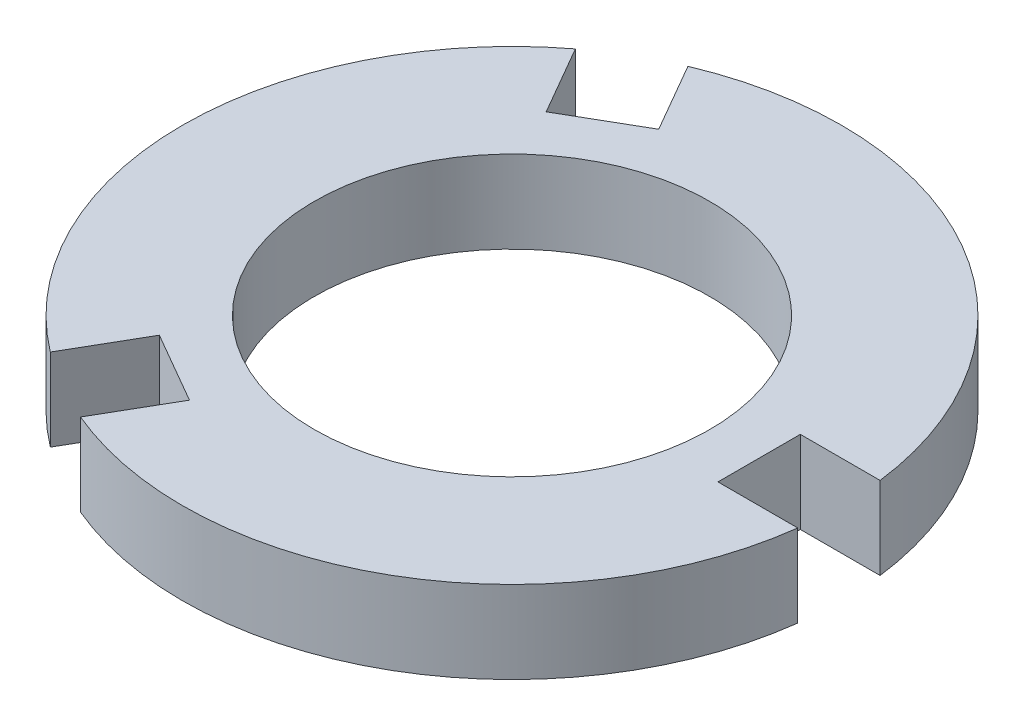
ISO-10303-21;
HEADER;
FILE_DESCRIPTION(('STEP AP214'),'2;1');
FILE_NAME('part.step','',(''),(''),'','','');
FILE_SCHEMA(('AUTOMOTIVE_DESIGN { 1 0 10303 214 1 1 1 1 }'));
ENDSEC;
DATA;
#1=APPLICATION_CONTEXT('core data for automotive mechanical design processes');
#2=APPLICATION_PROTOCOL_DEFINITION('international standard','automotive_design',2000,#1);
#3=PRODUCT_CONTEXT('',#1,'mechanical');
#4=PRODUCT('Part','Part','',(#3));
#5=PRODUCT_RELATED_PRODUCT_CATEGORY('part','',(#4));
#6=PRODUCT_DEFINITION_FORMATION('','',#4);
#7=PRODUCT_DEFINITION_CONTEXT('part definition',#1,'design');
#8=PRODUCT_DEFINITION('design','',#6,#7);
#9=PRODUCT_DEFINITION_SHAPE('','',#8);
#10=(LENGTH_UNIT() NAMED_UNIT(*) SI_UNIT(.MILLI.,.METRE.));
#11=(NAMED_UNIT(*) PLANE_ANGLE_UNIT() SI_UNIT($,.RADIAN.));
#12=(NAMED_UNIT(*) SI_UNIT($,.STERADIAN.) SOLID_ANGLE_UNIT());
#13=UNCERTAINTY_MEASURE_WITH_UNIT(LENGTH_MEASURE(1.E-05),#10,'distance_accuracy_value','');
#14=(GEOMETRIC_REPRESENTATION_CONTEXT(3) GLOBAL_UNCERTAINTY_ASSIGNED_CONTEXT((#13)) GLOBAL_UNIT_ASSIGNED_CONTEXT((#10,
#11,#12)) REPRESENTATION_CONTEXT('',''));
#15=CARTESIAN_POINT('',(0.,0.,0.));
#16=DIRECTION('',(0.,0.,1.));
#17=DIRECTION('',(1.,0.,0.));
#18=AXIS2_PLACEMENT_3D('',#15,#16,#17);
#19=CARTESIAN_POINT('',(0.,25.,0.));
#20=DIRECTION('',(0.,-1.,0.));
#21=DIRECTION('',(0.,0.,-1.));
#22=AXIS2_PLACEMENT_3D('',#19,#20,#21);
#23=CYLINDRICAL_SURFACE('',#22,100.);
#24=CARTESIAN_POINT('',(0.,25.,0.));
#25=DIRECTION('',(0.,1.,0.));
#26=DIRECTION('',(0.,0.,1.));
#27=AXIS2_PLACEMENT_3D('',#24,#25,#26);
#28=CIRCLE('',#27,100.);
#29=CARTESIAN_POINT('',(-60.4331546297669,25.,-79.6732942804217));
#30=VERTEX_POINT('',#29);
#31=CARTESIAN_POINT('',(-60.4331546297658,25.,79.6732942804226));
#32=VERTEX_POINT('',#31);
#33=EDGE_CURVE('E209',#30,#32,#28,.T.);
#34=ORIENTED_EDGE('',*,*,#33,.F.);
#35=DIRECTION('',(0.,-1.,0.));
#36=VECTOR('',#35,1.);
#37=CARTESIAN_POINT('',(-60.4331546297669,25.,-79.6732942804217));
#38=LINE('',#37,#36);
#39=CARTESIAN_POINT('',(-60.4331546297669,0.,-79.6732942804217));
#40=VERTEX_POINT('',#39);
#41=EDGE_CURVE('E11',#30,#40,#38,.T.);
#42=ORIENTED_EDGE('',*,*,#41,.T.);
#43=CARTESIAN_POINT('',(0.,0.,0.));
#44=DIRECTION('',(0.,1.,0.));
#45=DIRECTION('',(0.,0.,1.));
#46=AXIS2_PLACEMENT_3D('',#43,#44,#45);
#47=CIRCLE('',#46,100.);
#48=CARTESIAN_POINT('',(-60.4331546297658,0.,79.6732942804226));
#49=VERTEX_POINT('',#48);
#50=EDGE_CURVE('E213',#40,#49,#47,.T.);
#51=ORIENTED_EDGE('',*,*,#50,.T.);
#52=DIRECTION('',(0.,-1.,0.));
#53=VECTOR('',#52,1.);
#54=CARTESIAN_POINT('',(-60.4331546297658,25.,79.6732942804226));
#55=LINE('',#54,#53);
#56=EDGE_CURVE('E219',#49,#32,#55,.F.);
#57=ORIENTED_EDGE('',*,*,#56,.T.);
#58=EDGE_LOOP('',(#34,#42,#51,#57));
#59=FACE_BOUND('',#58,.T.);
#60=ADVANCED_FACE('F37',(#59),#23,.T.);
#61=CARTESIAN_POINT('',(-38.7825195351547,25.,92.1732942804224));
#62=VERTEX_POINT('',#61);
#63=CARTESIAN_POINT('',(99.2156741649221,25.,12.5));
#64=VERTEX_POINT('',#63);
#65=EDGE_CURVE('E210',#62,#64,#28,.T.);
#66=ORIENTED_EDGE('',*,*,#65,.F.);
#67=DIRECTION('',(0.,-1.,0.));
#68=VECTOR('',#67,1.);
#69=CARTESIAN_POINT('',(-38.7825195351547,25.,92.1732942804224));
#70=LINE('',#69,#68);
#71=CARTESIAN_POINT('',(-38.7825195351547,0.,92.1732942804224));
#72=VERTEX_POINT('',#71);
#73=EDGE_CURVE('E221',#62,#72,#70,.T.);
#74=ORIENTED_EDGE('',*,*,#73,.T.);
#75=CARTESIAN_POINT('',(99.2156741649221,0.,12.5));
#76=VERTEX_POINT('',#75);
#77=EDGE_CURVE('E202',#72,#76,#47,.T.);
#78=ORIENTED_EDGE('',*,*,#77,.T.);
#79=DIRECTION('',(0.,-1.,0.));
#80=VECTOR('',#79,1.);
#81=CARTESIAN_POINT('',(99.2156741649221,25.,12.5));
#82=LINE('',#81,#80);
#83=EDGE_CURVE('E208',#76,#64,#82,.F.);
#84=ORIENTED_EDGE('',*,*,#83,.T.);
#85=EDGE_LOOP('',(#66,#74,#78,#84));
#86=FACE_BOUND('',#85,.T.);
#87=ADVANCED_FACE('F244',(#86),#23,.T.);
#88=CARTESIAN_POINT('',(0.,25.,0.));
#89=DIRECTION('',(0.,1.,0.));
#90=DIRECTION('',(0.,0.,1.));
#91=AXIS2_PLACEMENT_3D('',#88,#89,#90);
#92=PLANE('',#91);
#93=DIRECTION('',(0.500000000000004,0.,0.866025403784436));
#94=VECTOR('',#93,1.);
#95=CARTESIAN_POINT('',(-48.3253175473058,25.,-58.7019052838327));
#96=LINE('',#95,#94);
#97=CARTESIAN_POINT('',(-48.3253175473058,25.,-58.7019052838327));
#98=VERTEX_POINT('',#97);
#99=EDGE_CURVE('E148',#30,#98,#96,.T.);
#100=ORIENTED_EDGE('',*,*,#99,.F.);
#101=ORIENTED_EDGE('',*,*,#33,.T.);
#102=DIRECTION('',(-0.499999999999992,0.,0.866025403784443));
#103=VECTOR('',#102,1.);
#104=CARTESIAN_POINT('',(-48.3253175473049,25.,58.7019052838334));
#105=LINE('',#104,#103);
#106=CARTESIAN_POINT('',(-48.3253175473049,25.,58.7019052838334));
#107=VERTEX_POINT('',#106);
#108=EDGE_CURVE('E52',#107,#32,#105,.T.);
#109=ORIENTED_EDGE('',*,*,#108,.F.);
#110=DIRECTION('',(-0.866025403784443,0.,-0.499999999999991));
#111=VECTOR('',#110,1.);
#112=CARTESIAN_POINT('',(-26.6746824526939,25.,71.2019052838331));
#113=LINE('',#112,#111);
#114=CARTESIAN_POINT('',(-26.6746824526939,25.,71.2019052838331));
#115=VERTEX_POINT('',#114);
#116=EDGE_CURVE('E169',#115,#107,#113,.T.);
#117=ORIENTED_EDGE('',*,*,#116,.F.);
#118=DIRECTION('',(0.499999999999992,0.,-0.866025403784443));
#119=VECTOR('',#118,1.);
#120=CARTESIAN_POINT('',(-26.6746824526939,25.,71.2019052838331));
#121=LINE('',#120,#119);
#122=EDGE_CURVE('E162',#62,#115,#121,.T.);
#123=ORIENTED_EDGE('',*,*,#122,.F.);
#124=ORIENTED_EDGE('',*,*,#65,.T.);
#125=DIRECTION('',(1.,0.,0.));
#126=VECTOR('',#125,1.);
#127=CARTESIAN_POINT('',(75.,25.,12.5));
#128=LINE('',#127,#126);
#129=CARTESIAN_POINT('',(75.,25.,12.5));
#130=VERTEX_POINT('',#129);
#131=EDGE_CURVE('E190',#130,#64,#128,.T.);
#132=ORIENTED_EDGE('',*,*,#131,.F.);
#133=DIRECTION('',(0.,0.,1.));
#134=VECTOR('',#133,1.);
#135=CARTESIAN_POINT('',(75.,25.,-12.5));
#136=LINE('',#135,#134);
#137=CARTESIAN_POINT('',(75.,25.,-12.5));
#138=VERTEX_POINT('',#137);
#139=EDGE_CURVE('E156',#138,#130,#136,.T.);
#140=ORIENTED_EDGE('',*,*,#139,.F.);
#141=DIRECTION('',(-1.,0.,0.));
#142=VECTOR('',#141,1.);
#143=CARTESIAN_POINT('',(75.,25.,-12.5));
#144=LINE('',#143,#142);
#145=CARTESIAN_POINT('',(99.2156741649222,25.,-12.5));
#146=VERTEX_POINT('',#145);
#147=EDGE_CURVE('E181',#146,#138,#144,.T.);
#148=ORIENTED_EDGE('',*,*,#147,.F.);
#149=CARTESIAN_POINT('',(-38.782519535156,25.,-92.1732942804218));
#150=VERTEX_POINT('',#149);
#151=EDGE_CURVE('E205',#146,#150,#28,.T.);
#152=ORIENTED_EDGE('',*,*,#151,.T.);
#153=DIRECTION('',(-0.500000000000004,0.,-0.866025403784436));
#154=VECTOR('',#153,1.);
#155=CARTESIAN_POINT('',(-26.6746824526949,25.,-71.2019052838328));
#156=LINE('',#155,#154);
#157=CARTESIAN_POINT('',(-26.6746824526949,25.,-71.2019052838328));
#158=VERTEX_POINT('',#157);
#159=EDGE_CURVE('E60',#158,#150,#156,.T.);
#160=ORIENTED_EDGE('',*,*,#159,.F.);
#161=DIRECTION('',(0.866025403784436,0.,-0.500000000000005));
#162=VECTOR('',#161,1.);
#163=CARTESIAN_POINT('',(-48.3253175473058,25.,-58.7019052838327));
#164=LINE('',#163,#162);
#165=EDGE_CURVE('E134',#98,#158,#164,.T.);
#166=ORIENTED_EDGE('',*,*,#165,.F.);
#167=EDGE_LOOP('',(#100,#101,#109,#117,#123,#124,#132,#140,#148,#152,#160,#166));
#168=FACE_BOUND('',#167,.T.);
#169=CARTESIAN_POINT('',(0.,25.,0.));
#170=DIRECTION('',(0.,1.,0.));
#171=DIRECTION('',(0.,0.,1.));
#172=AXIS2_PLACEMENT_3D('',#169,#170,#171);
#173=CIRCLE('',#172,60.);
#174=CARTESIAN_POINT('',(0.,25.,60.));
#175=VERTEX_POINT('',#174);
#176=EDGE_CURVE('E199',#175,#175,#173,.T.);
#177=ORIENTED_EDGE('',*,*,#176,.F.);
#178=EDGE_LOOP('',(#177));
#179=FACE_BOUND('',#178,.T.);
#180=ADVANCED_FACE('F228',(#168,#179),#92,.T.);
#181=CARTESIAN_POINT('',(0.,0.,0.));
#182=DIRECTION('',(0.,1.,0.));
#183=DIRECTION('',(0.,0.,1.));
#184=AXIS2_PLACEMENT_3D('',#181,#182,#183);
#185=PLANE('',#184);
#186=ORIENTED_EDGE('',*,*,#50,.F.);
#187=DIRECTION('',(0.500000000000004,0.,0.866025403784436));
#188=VECTOR('',#187,1.);
#189=CARTESIAN_POINT('',(-48.3253175473058,0.,-58.7019052838327));
#190=LINE('',#189,#188);
#191=CARTESIAN_POINT('',(-48.3253175473058,0.,-58.7019052838327));
#192=VERTEX_POINT('',#191);
#193=EDGE_CURVE('E136',#40,#192,#190,.T.);
#194=ORIENTED_EDGE('',*,*,#193,.T.);
#195=DIRECTION('',(0.866025403784436,0.,-0.500000000000005));
#196=VECTOR('',#195,1.);
#197=CARTESIAN_POINT('',(-48.3253175473058,0.,-58.7019052838327));
#198=LINE('',#197,#196);
#199=CARTESIAN_POINT('',(-26.6746824526949,0.,-71.2019052838328));
#200=VERTEX_POINT('',#199);
#201=EDGE_CURVE('E131',#192,#200,#198,.T.);
#202=ORIENTED_EDGE('',*,*,#201,.T.);
#203=DIRECTION('',(-0.500000000000004,0.,-0.866025403784436));
#204=VECTOR('',#203,1.);
#205=CARTESIAN_POINT('',(-26.6746824526949,0.,-71.2019052838328));
#206=LINE('',#205,#204);
#207=CARTESIAN_POINT('',(-38.782519535156,0.,-92.1732942804218));
#208=VERTEX_POINT('',#207);
#209=EDGE_CURVE('E139',#200,#208,#206,.T.);
#210=ORIENTED_EDGE('',*,*,#209,.T.);
#211=CARTESIAN_POINT('',(99.2156741649222,0.,-12.5));
#212=VERTEX_POINT('',#211);
#213=EDGE_CURVE('E211',#212,#208,#47,.T.);
#214=ORIENTED_EDGE('',*,*,#213,.F.);
#215=DIRECTION('',(-1.,0.,0.));
#216=VECTOR('',#215,1.);
#217=CARTESIAN_POINT('',(75.,0.,-12.5));
#218=LINE('',#217,#216);
#219=CARTESIAN_POINT('',(75.,0.,-12.5));
#220=VERTEX_POINT('',#219);
#221=EDGE_CURVE('E184',#212,#220,#218,.T.);
#222=ORIENTED_EDGE('',*,*,#221,.T.);
#223=DIRECTION('',(0.,0.,1.));
#224=VECTOR('',#223,1.);
#225=CARTESIAN_POINT('',(75.,0.,-12.5));
#226=LINE('',#225,#224);
#227=CARTESIAN_POINT('',(75.,0.,12.5));
#228=VERTEX_POINT('',#227);
#229=EDGE_CURVE('E177',#220,#228,#226,.T.);
#230=ORIENTED_EDGE('',*,*,#229,.T.);
#231=DIRECTION('',(1.,0.,0.));
#232=VECTOR('',#231,1.);
#233=CARTESIAN_POINT('',(75.,0.,12.5));
#234=LINE('',#233,#232);
#235=EDGE_CURVE('E180',#228,#76,#234,.T.);
#236=ORIENTED_EDGE('',*,*,#235,.T.);
#237=ORIENTED_EDGE('',*,*,#77,.F.);
#238=DIRECTION('',(0.499999999999992,0.,-0.866025403784443));
#239=VECTOR('',#238,1.);
#240=CARTESIAN_POINT('',(-26.6746824526939,0.,71.2019052838331));
#241=LINE('',#240,#239);
#242=CARTESIAN_POINT('',(-26.6746824526939,0.,71.2019052838331));
#243=VERTEX_POINT('',#242);
#244=EDGE_CURVE('E165',#72,#243,#241,.T.);
#245=ORIENTED_EDGE('',*,*,#244,.T.);
#246=DIRECTION('',(-0.866025403784443,0.,-0.499999999999991));
#247=VECTOR('',#246,1.);
#248=CARTESIAN_POINT('',(-26.6746824526939,0.,71.2019052838331));
#249=LINE('',#248,#247);
#250=CARTESIAN_POINT('',(-48.3253175473049,0.,58.7019052838334));
#251=VERTEX_POINT('',#250);
#252=EDGE_CURVE('E158',#243,#251,#249,.T.);
#253=ORIENTED_EDGE('',*,*,#252,.T.);
#254=DIRECTION('',(-0.499999999999992,0.,0.866025403784443));
#255=VECTOR('',#254,1.);
#256=CARTESIAN_POINT('',(-48.3253175473049,0.,58.7019052838334));
#257=LINE('',#256,#255);
#258=EDGE_CURVE('E161',#251,#49,#257,.T.);
#259=ORIENTED_EDGE('',*,*,#258,.T.);
#260=EDGE_LOOP('',(#186,#194,#202,#210,#214,#222,#230,#236,#237,#245,#253,#259));
#261=FACE_BOUND('',#260,.T.);
#262=CARTESIAN_POINT('',(0.,0.,0.));
#263=DIRECTION('',(0.,1.,0.));
#264=DIRECTION('',(0.,0.,1.));
#265=AXIS2_PLACEMENT_3D('',#262,#263,#264);
#266=CIRCLE('',#265,60.);
#267=CARTESIAN_POINT('',(0.,0.,60.));
#268=VERTEX_POINT('',#267);
#269=EDGE_CURVE('E197',#268,#268,#266,.T.);
#270=ORIENTED_EDGE('',*,*,#269,.T.);
#271=EDGE_LOOP('',(#270));
#272=FACE_BOUND('',#271,.T.);
#273=ADVANCED_FACE('F146',(#261,#272),#185,.F.);
#274=ORIENTED_EDGE('',*,*,#213,.T.);
#275=DIRECTION('',(0.,-1.,0.));
#276=VECTOR('',#275,1.);
#277=CARTESIAN_POINT('',(-38.782519535156,25.,-92.1732942804218));
#278=LINE('',#277,#276);
#279=EDGE_CURVE('E45',#208,#150,#278,.F.);
#280=ORIENTED_EDGE('',*,*,#279,.T.);
#281=ORIENTED_EDGE('',*,*,#151,.F.);
#282=DIRECTION('',(0.,-1.,0.));
#283=VECTOR('',#282,1.);
#284=CARTESIAN_POINT('',(99.2156741649222,25.,-12.5));
#285=LINE('',#284,#283);
#286=EDGE_CURVE('E216',#146,#212,#285,.T.);
#287=ORIENTED_EDGE('',*,*,#286,.T.);
#288=EDGE_LOOP('',(#274,#280,#281,#287));
#289=FACE_BOUND('',#288,.T.);
#290=ADVANCED_FACE('F39',(#289),#23,.T.);
#291=CARTESIAN_POINT('',(0.,25.,0.));
#292=DIRECTION('',(0.,-1.,0.));
#293=DIRECTION('',(0.,0.,-1.));
#294=AXIS2_PLACEMENT_3D('',#291,#292,#293);
#295=CYLINDRICAL_SURFACE('',#294,60.);
#296=ORIENTED_EDGE('',*,*,#176,.T.);
#297=EDGE_LOOP('',(#296));
#298=FACE_BOUND('',#297,.T.);
#299=ORIENTED_EDGE('',*,*,#269,.F.);
#300=EDGE_LOOP('',(#299));
#301=FACE_BOUND('',#300,.T.);
#302=ADVANCED_FACE('F272',(#298,#301),#295,.F.);
#303=CARTESIAN_POINT('',(75.,0.,-12.5));
#304=DIRECTION('',(0.,0.,-1.));
#305=DIRECTION('',(-1.,0.,0.));
#306=AXIS2_PLACEMENT_3D('',#303,#304,#305);
#307=PLANE('',#306);
#308=ORIENTED_EDGE('',*,*,#147,.T.);
#309=DIRECTION('',(0.,1.,0.));
#310=VECTOR('',#309,1.);
#311=CARTESIAN_POINT('',(75.,0.,-12.5));
#312=LINE('',#311,#310);
#313=EDGE_CURVE('E194',#220,#138,#312,.T.);
#314=ORIENTED_EDGE('',*,*,#313,.F.);
#315=ORIENTED_EDGE('',*,*,#221,.F.);
#316=ORIENTED_EDGE('',*,*,#286,.F.);
#317=EDGE_LOOP('',(#308,#314,#315,#316));
#318=FACE_BOUND('',#317,.T.);
#319=ADVANCED_FACE('F233',(#318),#307,.F.);
#320=CARTESIAN_POINT('',(75.,0.,12.5));
#321=DIRECTION('',(0.,0.,1.));
#322=DIRECTION('',(1.,0.,0.));
#323=AXIS2_PLACEMENT_3D('',#320,#321,#322);
#324=PLANE('',#323);
#325=ORIENTED_EDGE('',*,*,#235,.F.);
#326=DIRECTION('',(0.,1.,0.));
#327=VECTOR('',#326,1.);
#328=CARTESIAN_POINT('',(75.,0.,12.5));
#329=LINE('',#328,#327);
#330=EDGE_CURVE('E187',#228,#130,#329,.T.);
#331=ORIENTED_EDGE('',*,*,#330,.T.);
#332=ORIENTED_EDGE('',*,*,#131,.T.);
#333=ORIENTED_EDGE('',*,*,#83,.F.);
#334=EDGE_LOOP('',(#325,#331,#332,#333));
#335=FACE_BOUND('',#334,.T.);
#336=ADVANCED_FACE('F241',(#335),#324,.F.);
#337=CARTESIAN_POINT('',(75.,0.,-12.5));
#338=DIRECTION('',(-1.,0.,0.));
#339=DIRECTION('',(0.,0.,1.));
#340=AXIS2_PLACEMENT_3D('',#337,#338,#339);
#341=PLANE('',#340);
#342=ORIENTED_EDGE('',*,*,#139,.T.);
#343=ORIENTED_EDGE('',*,*,#330,.F.);
#344=ORIENTED_EDGE('',*,*,#229,.F.);
#345=ORIENTED_EDGE('',*,*,#313,.T.);
#346=EDGE_LOOP('',(#342,#343,#344,#345));
#347=FACE_BOUND('',#346,.T.);
#348=ADVANCED_FACE('F236',(#347),#341,.F.);
#349=CARTESIAN_POINT('',(-26.6746824526939,0.,71.2019052838331));
#350=DIRECTION('',(0.866025403784443,0.,0.499999999999992));
#351=DIRECTION('',(0.499999999999992,0.,-0.866025403784443));
#352=AXIS2_PLACEMENT_3D('',#349,#350,#351);
#353=PLANE('',#352);
#354=ORIENTED_EDGE('',*,*,#122,.T.);
#355=DIRECTION('',(0.,1.,0.));
#356=VECTOR('',#355,1.);
#357=CARTESIAN_POINT('',(-26.6746824526939,0.,71.2019052838331));
#358=LINE('',#357,#356);
#359=EDGE_CURVE('E154',#243,#115,#358,.T.);
#360=ORIENTED_EDGE('',*,*,#359,.F.);
#361=ORIENTED_EDGE('',*,*,#244,.F.);
#362=ORIENTED_EDGE('',*,*,#73,.F.);
#363=EDGE_LOOP('',(#354,#360,#361,#362));
#364=FACE_BOUND('',#363,.T.);
#365=ADVANCED_FACE('F257',(#364),#353,.F.);
#366=CARTESIAN_POINT('',(-48.3253175473049,0.,58.7019052838334));
#367=DIRECTION('',(-0.866025403784443,0.,-0.499999999999992));
#368=DIRECTION('',(-0.499999999999992,0.,0.866025403784443));
#369=AXIS2_PLACEMENT_3D('',#366,#367,#368);
#370=PLANE('',#369);
#371=ORIENTED_EDGE('',*,*,#258,.F.);
#372=DIRECTION('',(0.,1.,0.));
#373=VECTOR('',#372,1.);
#374=CARTESIAN_POINT('',(-48.3253175473049,0.,58.7019052838334));
#375=LINE('',#374,#373);
#376=EDGE_CURVE('E168',#251,#107,#375,.T.);
#377=ORIENTED_EDGE('',*,*,#376,.T.);
#378=ORIENTED_EDGE('',*,*,#108,.T.);
#379=ORIENTED_EDGE('',*,*,#56,.F.);
#380=EDGE_LOOP('',(#371,#377,#378,#379));
#381=FACE_BOUND('',#380,.T.);
#382=ADVANCED_FACE('F251',(#381),#370,.F.);
#383=CARTESIAN_POINT('',(-26.6746824526939,0.,71.2019052838331));
#384=DIRECTION('',(0.499999999999992,0.,-0.866025403784443));
#385=DIRECTION('',(-0.866025403784444,0.,-0.499999999999992));
#386=AXIS2_PLACEMENT_3D('',#383,#384,#385);
#387=PLANE('',#386);
#388=ORIENTED_EDGE('',*,*,#116,.T.);
#389=ORIENTED_EDGE('',*,*,#376,.F.);
#390=ORIENTED_EDGE('',*,*,#252,.F.);
#391=ORIENTED_EDGE('',*,*,#359,.T.);
#392=EDGE_LOOP('',(#388,#389,#390,#391));
#393=FACE_BOUND('',#392,.T.);
#394=ADVANCED_FACE('F254',(#393),#387,.F.);
#395=CARTESIAN_POINT('',(-48.3253175473058,0.,-58.7019052838327));
#396=DIRECTION('',(-0.866025403784436,0.,0.500000000000004));
#397=DIRECTION('',(0.500000000000004,0.,0.866025403784436));
#398=AXIS2_PLACEMENT_3D('',#395,#396,#397);
#399=PLANE('',#398);
#400=ORIENTED_EDGE('',*,*,#99,.T.);
#401=DIRECTION('',(0.,1.,0.));
#402=VECTOR('',#401,1.);
#403=CARTESIAN_POINT('',(-48.3253175473058,0.,-58.7019052838327));
#404=LINE('',#403,#402);
#405=EDGE_CURVE('E135',#192,#98,#404,.T.);
#406=ORIENTED_EDGE('',*,*,#405,.F.);
#407=ORIENTED_EDGE('',*,*,#193,.F.);
#408=ORIENTED_EDGE('',*,*,#41,.F.);
#409=EDGE_LOOP('',(#400,#406,#407,#408));
#410=FACE_BOUND('',#409,.T.);
#411=ADVANCED_FACE('F289',(#410),#399,.F.);
#412=CARTESIAN_POINT('',(-26.6746824526949,0.,-71.2019052838328));
#413=DIRECTION('',(0.866025403784436,0.,-0.500000000000004));
#414=DIRECTION('',(-0.500000000000004,0.,-0.866025403784436));
#415=AXIS2_PLACEMENT_3D('',#412,#413,#414);
#416=PLANE('',#415);
#417=ORIENTED_EDGE('',*,*,#209,.F.);
#418=DIRECTION('',(0.,1.,0.));
#419=VECTOR('',#418,1.);
#420=CARTESIAN_POINT('',(-26.6746824526949,0.,-71.2019052838328));
#421=LINE('',#420,#419);
#422=EDGE_CURVE('E126',#200,#158,#421,.T.);
#423=ORIENTED_EDGE('',*,*,#422,.T.);
#424=ORIENTED_EDGE('',*,*,#159,.T.);
#425=ORIENTED_EDGE('',*,*,#279,.F.);
#426=EDGE_LOOP('',(#417,#423,#424,#425));
#427=FACE_BOUND('',#426,.T.);
#428=ADVANCED_FACE('F140',(#427),#416,.F.);
#429=CARTESIAN_POINT('',(-48.3253175473058,0.,-58.7019052838327));
#430=DIRECTION('',(0.500000000000005,0.,0.866025403784436));
#431=DIRECTION('',(0.866025403784436,0.,-0.500000000000005));
#432=AXIS2_PLACEMENT_3D('',#429,#430,#431);
#433=PLANE('',#432);
#434=ORIENTED_EDGE('',*,*,#165,.T.);
#435=ORIENTED_EDGE('',*,*,#422,.F.);
#436=ORIENTED_EDGE('',*,*,#201,.F.);
#437=ORIENTED_EDGE('',*,*,#405,.T.);
#438=EDGE_LOOP('',(#434,#435,#436,#437));
#439=FACE_BOUND('',#438,.T.);
#440=ADVANCED_FACE('F128',(#439),#433,.F.);
#441=CLOSED_SHELL('',(#60,#87,#180,#273,#290,#302,#319,#336,#348,#365,#382,#394,#411,#428,#440));
#442=MANIFOLD_SOLID_BREP('B2',#441);
#443=ADVANCED_BREP_SHAPE_REPRESENTATION('',(#18,#442),#14);
#444=SHAPE_DEFINITION_REPRESENTATION(#9,#443);
ENDSEC;
END-ISO-10303-21;
